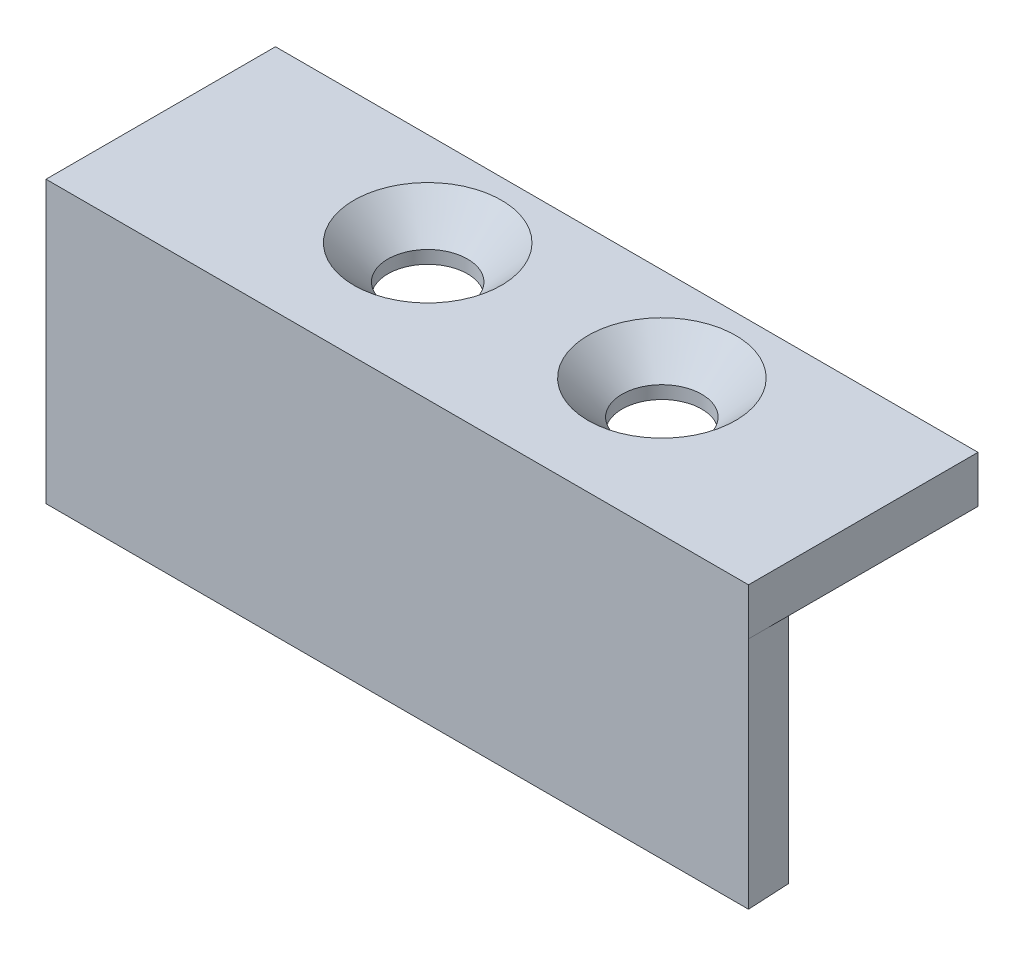
ISO-10303-21;
HEADER;
FILE_DESCRIPTION(('STEP AP214'),'2;1');
FILE_NAME('part.step','',(''),(''),'','','');
FILE_SCHEMA(('AUTOMOTIVE_DESIGN { 1 0 10303 214 1 1 1 1 }'));
ENDSEC;
DATA;
#1=APPLICATION_CONTEXT('core data for automotive mechanical design processes');
#2=APPLICATION_PROTOCOL_DEFINITION('international standard','automotive_design',2000,#1);
#3=PRODUCT_CONTEXT('',#1,'mechanical');
#4=PRODUCT('Part','Part','',(#3));
#5=PRODUCT_RELATED_PRODUCT_CATEGORY('part','',(#4));
#6=PRODUCT_DEFINITION_FORMATION('','',#4);
#7=PRODUCT_DEFINITION_CONTEXT('part definition',#1,'design');
#8=PRODUCT_DEFINITION('design','',#6,#7);
#9=PRODUCT_DEFINITION_SHAPE('','',#8);
#10=(LENGTH_UNIT() NAMED_UNIT(*) SI_UNIT(.MILLI.,.METRE.));
#11=(NAMED_UNIT(*) PLANE_ANGLE_UNIT() SI_UNIT($,.RADIAN.));
#12=(NAMED_UNIT(*) SI_UNIT($,.STERADIAN.) SOLID_ANGLE_UNIT());
#13=UNCERTAINTY_MEASURE_WITH_UNIT(LENGTH_MEASURE(1.E-05),#10,'distance_accuracy_value','');
#14=(GEOMETRIC_REPRESENTATION_CONTEXT(3) GLOBAL_UNCERTAINTY_ASSIGNED_CONTEXT((#13)) GLOBAL_UNIT_ASSIGNED_CONTEXT((#10,
#11,#12)) REPRESENTATION_CONTEXT('',''));
#15=CARTESIAN_POINT('',(0.,0.,0.));
#16=DIRECTION('',(0.,0.,1.));
#17=DIRECTION('',(1.,0.,0.));
#18=AXIS2_PLACEMENT_3D('',#15,#16,#17);
#19=CARTESIAN_POINT('',(0.,0.,0.));
#20=DIRECTION('',(0.,1.,0.));
#21=DIRECTION('',(0.,0.,1.));
#22=AXIS2_PLACEMENT_3D('',#19,#20,#21);
#23=PLANE('',#22);
#24=CARTESIAN_POINT('',(10.5,0.,-9.));
#25=DIRECTION('',(0.,1.,0.));
#26=DIRECTION('',(0.,0.,1.));
#27=AXIS2_PLACEMENT_3D('',#24,#25,#26);
#28=CIRCLE('',#27,1.69999999999999);
#29=CARTESIAN_POINT('',(10.5,0.,-7.30000000000001));
#30=VERTEX_POINT('',#29);
#31=EDGE_CURVE('E143',#30,#30,#28,.T.);
#32=ORIENTED_EDGE('',*,*,#31,.T.);
#33=EDGE_LOOP('',(#32));
#34=FACE_BOUND('',#33,.T.);
#35=CARTESIAN_POINT('',(0.500000000000007,0.,-9.));
#36=DIRECTION('',(0.,1.,0.));
#37=DIRECTION('',(0.,0.,1.));
#38=AXIS2_PLACEMENT_3D('',#35,#36,#37);
#39=CIRCLE('',#38,1.69999999999999);
#40=CARTESIAN_POINT('',(0.500000000000007,0.,-7.3));
#41=VERTEX_POINT('',#40);
#42=EDGE_CURVE('E36',#41,#41,#39,.T.);
#43=ORIENTED_EDGE('',*,*,#42,.T.);
#44=EDGE_LOOP('',(#43));
#45=FACE_BOUND('',#44,.T.);
#46=DIRECTION('',(0.0520185859715963,0.,0.998646116856975));
#47=VECTOR('',#46,1.);
#48=CARTESIAN_POINT('',(20.,0.,-3.19999999999999));
#49=LINE('',#48,#47);
#50=CARTESIAN_POINT('',(19.9063665452511,0.,-4.99756301034248));
#51=VERTEX_POINT('',#50);
#52=CARTESIAN_POINT('',(20.,0.,-3.19999999999994));
#53=VERTEX_POINT('',#52);
#54=EDGE_CURVE('E117',#51,#53,#49,.T.);
#55=ORIENTED_EDGE('',*,*,#54,.F.);
#56=DIRECTION('',(1.,0.,0.));
#57=VECTOR('',#56,1.);
#58=CARTESIAN_POINT('',(19.9063665452511,0.,-4.99756301034248));
#59=LINE('',#58,#57);
#60=CARTESIAN_POINT('',(-9.99999999999999,0.,-4.99756301034247));
#61=VERTEX_POINT('',#60);
#62=EDGE_CURVE('E49',#61,#51,#59,.T.);
#63=ORIENTED_EDGE('',*,*,#62,.F.);
#64=DIRECTION('',(0.,0.,1.));
#65=VECTOR('',#64,1.);
#66=CARTESIAN_POINT('',(-10.,0.,-12.9999999999999));
#67=LINE('',#66,#65);
#68=CARTESIAN_POINT('',(-10.,0.,-12.9999999999999));
#69=VERTEX_POINT('',#68);
#70=EDGE_CURVE('E151',#69,#61,#67,.T.);
#71=ORIENTED_EDGE('',*,*,#70,.F.);
#72=DIRECTION('',(-1.,0.,0.));
#73=VECTOR('',#72,1.);
#74=CARTESIAN_POINT('',(-10.,0.,-12.9999999999999));
#75=LINE('',#74,#73);
#76=CARTESIAN_POINT('',(20.,0.,-13.));
#77=VERTEX_POINT('',#76);
#78=EDGE_CURVE('E76',#77,#69,#75,.T.);
#79=ORIENTED_EDGE('',*,*,#78,.F.);
#80=DIRECTION('',(0.,0.,-1.));
#81=VECTOR('',#80,1.);
#82=CARTESIAN_POINT('',(20.,0.,-13.));
#83=LINE('',#82,#81);
#84=EDGE_CURVE('E153',#53,#77,#83,.T.);
#85=ORIENTED_EDGE('',*,*,#84,.F.);
#86=EDGE_LOOP('',(#55,#63,#71,#79,#85));
#87=FACE_BOUND('',#86,.T.);
#88=ADVANCED_FACE('F32',(#34,#45,#87),#23,.F.);
#89=CARTESIAN_POINT('',(-10.,2.,-12.9999999999999));
#90=DIRECTION('',(1.,0.,0.));
#91=DIRECTION('',(0.,0.,-1.));
#92=AXIS2_PLACEMENT_3D('',#89,#90,#91);
#93=PLANE('',#92);
#94=ORIENTED_EDGE('',*,*,#70,.T.);
#95=DIRECTION('',(0.,1.,0.));
#96=VECTOR('',#95,1.);
#97=CARTESIAN_POINT('',(-10.,-10.,-4.99756301034247));
#98=LINE('',#97,#96);
#99=CARTESIAN_POINT('',(-10.,-10.,-4.99756301034247));
#100=VERTEX_POINT('',#99);
#101=EDGE_CURVE('E108',#100,#61,#98,.T.);
#102=ORIENTED_EDGE('',*,*,#101,.F.);
#103=DIRECTION('',(0.,0.,-1.));
#104=VECTOR('',#103,1.);
#105=CARTESIAN_POINT('',(-9.99999999999999,-10.,-3.19999999999991));
#106=LINE('',#105,#104);
#107=CARTESIAN_POINT('',(-9.99999999999999,-10.,-3.19999999999991));
#108=VERTEX_POINT('',#107);
#109=EDGE_CURVE('E106',#108,#100,#106,.T.);
#110=ORIENTED_EDGE('',*,*,#109,.F.);
#111=DIRECTION('',(0.,-1.,0.));
#112=VECTOR('',#111,1.);
#113=CARTESIAN_POINT('',(-9.99999999999999,2.,-3.19999999999991));
#114=LINE('',#113,#112);
#115=CARTESIAN_POINT('',(-9.99999999999999,2.,-3.19999999999991));
#116=VERTEX_POINT('',#115);
#117=EDGE_CURVE('E11',#116,#108,#114,.T.);
#118=ORIENTED_EDGE('',*,*,#117,.F.);
#119=DIRECTION('',(0.,0.,1.));
#120=VECTOR('',#119,1.);
#121=CARTESIAN_POINT('',(-10.,2.,-12.9999999999999));
#122=LINE('',#121,#120);
#123=CARTESIAN_POINT('',(-10.,2.,-12.9999999999999));
#124=VERTEX_POINT('',#123);
#125=EDGE_CURVE('E144',#124,#116,#122,.T.);
#126=ORIENTED_EDGE('',*,*,#125,.F.);
#127=DIRECTION('',(0.,-1.,0.));
#128=VECTOR('',#127,1.);
#129=CARTESIAN_POINT('',(-10.,2.,-12.9999999999999));
#130=LINE('',#129,#128);
#131=EDGE_CURVE('E150',#124,#69,#130,.T.);
#132=ORIENTED_EDGE('',*,*,#131,.T.);
#133=EDGE_LOOP('',(#94,#102,#110,#118,#126,#132));
#134=FACE_BOUND('',#133,.T.);
#135=ADVANCED_FACE('F34',(#134),#93,.F.);
#136=CARTESIAN_POINT('',(-9.99999999999999,2.,-3.19999999999991));
#137=DIRECTION('',(0.,0.,-1.));
#138=DIRECTION('',(-1.,0.,0.));
#139=AXIS2_PLACEMENT_3D('',#136,#137,#138);
#140=PLANE('',#139);
#141=ORIENTED_EDGE('',*,*,#117,.T.);
#142=DIRECTION('',(-1.,0.,0.));
#143=VECTOR('',#142,1.);
#144=CARTESIAN_POINT('',(-9.99999999999999,-10.,-3.19999999999991));
#145=LINE('',#144,#143);
#146=CARTESIAN_POINT('',(20.,-10.,-3.19999999999999));
#147=VERTEX_POINT('',#146);
#148=EDGE_CURVE('E102',#147,#108,#145,.T.);
#149=ORIENTED_EDGE('',*,*,#148,.F.);
#150=DIRECTION('',(0.,1.,0.));
#151=VECTOR('',#150,1.);
#152=CARTESIAN_POINT('',(20.,-10.,-3.19999999999999));
#153=LINE('',#152,#151);
#154=EDGE_CURVE('E124',#147,#53,#153,.T.);
#155=ORIENTED_EDGE('',*,*,#154,.T.);
#156=DIRECTION('',(0.,-1.,0.));
#157=VECTOR('',#156,1.);
#158=CARTESIAN_POINT('',(20.,2.,-3.19999999999994));
#159=LINE('',#158,#157);
#160=CARTESIAN_POINT('',(20.,2.,-3.19999999999994));
#161=VERTEX_POINT('',#160);
#162=EDGE_CURVE('E41',#161,#53,#159,.T.);
#163=ORIENTED_EDGE('',*,*,#162,.F.);
#164=DIRECTION('',(1.,0.,0.));
#165=VECTOR('',#164,1.);
#166=CARTESIAN_POINT('',(-9.99999999999999,2.,-3.19999999999991));
#167=LINE('',#166,#165);
#168=EDGE_CURVE('E83',#116,#161,#167,.T.);
#169=ORIENTED_EDGE('',*,*,#168,.F.);
#170=EDGE_LOOP('',(#141,#149,#155,#163,#169));
#171=FACE_BOUND('',#170,.T.);
#172=ADVANCED_FACE('F99',(#171),#140,.F.);
#173=CARTESIAN_POINT('',(20.,2.,-13.));
#174=DIRECTION('',(-1.,0.,0.));
#175=DIRECTION('',(0.,0.,1.));
#176=AXIS2_PLACEMENT_3D('',#173,#174,#175);
#177=PLANE('',#176);
#178=ORIENTED_EDGE('',*,*,#84,.T.);
#179=DIRECTION('',(0.,-1.,0.));
#180=VECTOR('',#179,1.);
#181=CARTESIAN_POINT('',(20.,2.,-13.));
#182=LINE('',#181,#180);
#183=CARTESIAN_POINT('',(20.,2.,-13.));
#184=VERTEX_POINT('',#183);
#185=EDGE_CURVE('E157',#184,#77,#182,.T.);
#186=ORIENTED_EDGE('',*,*,#185,.F.);
#187=DIRECTION('',(0.,0.,-1.));
#188=VECTOR('',#187,1.);
#189=CARTESIAN_POINT('',(20.,2.,-13.));
#190=LINE('',#189,#188);
#191=EDGE_CURVE('E147',#161,#184,#190,.T.);
#192=ORIENTED_EDGE('',*,*,#191,.F.);
#193=ORIENTED_EDGE('',*,*,#162,.T.);
#194=EDGE_LOOP('',(#178,#186,#192,#193));
#195=FACE_BOUND('',#194,.T.);
#196=ADVANCED_FACE('F188',(#195),#177,.F.);
#197=CARTESIAN_POINT('',(-10.,2.,-12.9999999999999));
#198=DIRECTION('',(0.,0.,1.));
#199=DIRECTION('',(1.,0.,0.));
#200=AXIS2_PLACEMENT_3D('',#197,#198,#199);
#201=PLANE('',#200);
#202=ORIENTED_EDGE('',*,*,#78,.T.);
#203=ORIENTED_EDGE('',*,*,#131,.F.);
#204=DIRECTION('',(-1.,0.,0.));
#205=VECTOR('',#204,1.);
#206=CARTESIAN_POINT('',(-10.,2.,-12.9999999999999));
#207=LINE('',#206,#205);
#208=EDGE_CURVE('E58',#184,#124,#207,.T.);
#209=ORIENTED_EDGE('',*,*,#208,.F.);
#210=ORIENTED_EDGE('',*,*,#185,.T.);
#211=EDGE_LOOP('',(#202,#203,#209,#210));
#212=FACE_BOUND('',#211,.T.);
#213=ADVANCED_FACE('F177',(#212),#201,.F.);
#214=CARTESIAN_POINT('',(0.,2.,0.));
#215=DIRECTION('',(0.,1.,0.));
#216=DIRECTION('',(0.,0.,1.));
#217=AXIS2_PLACEMENT_3D('',#214,#215,#216);
#218=PLANE('',#217);
#219=CARTESIAN_POINT('',(0.500000000000007,2.,-9.));
#220=DIRECTION('',(0.,1.,0.));
#221=DIRECTION('',(0.,0.,1.));
#222=AXIS2_PLACEMENT_3D('',#219,#220,#221);
#223=CIRCLE('',#222,3.15);
#224=CARTESIAN_POINT('',(0.500000000000007,2.,-5.85));
#225=VERTEX_POINT('',#224);
#226=EDGE_CURVE('E131',#225,#225,#223,.T.);
#227=ORIENTED_EDGE('',*,*,#226,.F.);
#228=EDGE_LOOP('',(#227));
#229=FACE_BOUND('',#228,.T.);
#230=CARTESIAN_POINT('',(10.5,2.,-9.));
#231=DIRECTION('',(0.,1.,0.));
#232=DIRECTION('',(0.,0.,1.));
#233=AXIS2_PLACEMENT_3D('',#230,#231,#232);
#234=CIRCLE('',#233,3.15);
#235=CARTESIAN_POINT('',(10.5,2.,-5.85));
#236=VERTEX_POINT('',#235);
#237=EDGE_CURVE('E137',#236,#236,#234,.T.);
#238=ORIENTED_EDGE('',*,*,#237,.F.);
#239=EDGE_LOOP('',(#238));
#240=FACE_BOUND('',#239,.T.);
#241=ORIENTED_EDGE('',*,*,#125,.T.);
#242=ORIENTED_EDGE('',*,*,#168,.T.);
#243=ORIENTED_EDGE('',*,*,#191,.T.);
#244=ORIENTED_EDGE('',*,*,#208,.T.);
#245=EDGE_LOOP('',(#241,#242,#243,#244));
#246=FACE_BOUND('',#245,.T.);
#247=ADVANCED_FACE('F167',(#229,#240,#246),#218,.T.);
#248=CARTESIAN_POINT('',(10.5,2.,-9.));
#249=DIRECTION('',(0.,1.,0.));
#250=DIRECTION('',(0.,0.,1.));
#251=AXIS2_PLACEMENT_3D('',#248,#249,#250);
#252=CYLINDRICAL_SURFACE('',#251,1.69999999999999);
#253=CARTESIAN_POINT('',(10.5,0.549999999999999,-9.));
#254=DIRECTION('',(0.,1.,0.));
#255=DIRECTION('',(0.,0.,1.));
#256=AXIS2_PLACEMENT_3D('',#253,#254,#255);
#257=CIRCLE('',#256,1.7);
#258=CARTESIAN_POINT('',(10.5,0.549999999999999,-7.3));
#259=VERTEX_POINT('',#258);
#260=EDGE_CURVE('E140',#259,#259,#257,.T.);
#261=ORIENTED_EDGE('',*,*,#260,.T.);
#262=EDGE_LOOP('',(#261));
#263=FACE_BOUND('',#262,.T.);
#264=ORIENTED_EDGE('',*,*,#31,.F.);
#265=EDGE_LOOP('',(#264));
#266=FACE_BOUND('',#265,.T.);
#267=ADVANCED_FACE('F164',(#263,#266),#252,.F.);
#268=CARTESIAN_POINT('',(10.5,2.,-9.));
#269=DIRECTION('',(0.,1.,0.));
#270=DIRECTION('',(0.,0.,1.));
#271=AXIS2_PLACEMENT_3D('',#268,#269,#270);
#272=CONICAL_SURFACE('',#271,3.15,0.785398163397448);
#273=ORIENTED_EDGE('',*,*,#260,.F.);
#274=EDGE_LOOP('',(#273));
#275=FACE_BOUND('',#274,.T.);
#276=ORIENTED_EDGE('',*,*,#237,.T.);
#277=EDGE_LOOP('',(#276));
#278=FACE_BOUND('',#277,.T.);
#279=ADVANCED_FACE('F166',(#275,#278),#272,.F.);
#280=CARTESIAN_POINT('',(0.500000000000007,2.,-9.));
#281=DIRECTION('',(0.,1.,0.));
#282=DIRECTION('',(0.,0.,1.));
#283=AXIS2_PLACEMENT_3D('',#280,#281,#282);
#284=CYLINDRICAL_SURFACE('',#283,1.69999999999999);
#285=CARTESIAN_POINT('',(0.500000000000007,0.549999999999999,-9.));
#286=DIRECTION('',(0.,1.,0.));
#287=DIRECTION('',(0.,0.,1.));
#288=AXIS2_PLACEMENT_3D('',#285,#286,#287);
#289=CIRCLE('',#288,1.7);
#290=CARTESIAN_POINT('',(0.500000000000007,0.549999999999999,-7.3));
#291=VERTEX_POINT('',#290);
#292=EDGE_CURVE('E134',#291,#291,#289,.T.);
#293=ORIENTED_EDGE('',*,*,#292,.T.);
#294=EDGE_LOOP('',(#293));
#295=FACE_BOUND('',#294,.T.);
#296=ORIENTED_EDGE('',*,*,#42,.F.);
#297=EDGE_LOOP('',(#296));
#298=FACE_BOUND('',#297,.T.);
#299=ADVANCED_FACE('F174',(#295,#298),#284,.F.);
#300=CARTESIAN_POINT('',(0.500000000000007,2.,-9.));
#301=DIRECTION('',(0.,1.,0.));
#302=DIRECTION('',(0.,0.,1.));
#303=AXIS2_PLACEMENT_3D('',#300,#301,#302);
#304=CONICAL_SURFACE('',#303,3.15,0.785398163397448);
#305=ORIENTED_EDGE('',*,*,#292,.F.);
#306=EDGE_LOOP('',(#305));
#307=FACE_BOUND('',#306,.T.);
#308=ORIENTED_EDGE('',*,*,#226,.T.);
#309=EDGE_LOOP('',(#308));
#310=FACE_BOUND('',#309,.T.);
#311=ADVANCED_FACE('F228',(#307,#310),#304,.F.);
#312=CARTESIAN_POINT('',(19.9063665452511,-10.,-4.99756301034248));
#313=DIRECTION('',(0.,0.,1.));
#314=DIRECTION('',(1.,0.,0.));
#315=AXIS2_PLACEMENT_3D('',#312,#313,#314);
#316=PLANE('',#315);
#317=ORIENTED_EDGE('',*,*,#62,.T.);
#318=DIRECTION('',(0.,1.,0.));
#319=VECTOR('',#318,1.);
#320=CARTESIAN_POINT('',(19.9063665452511,-10.,-4.99756301034248));
#321=LINE('',#320,#319);
#322=CARTESIAN_POINT('',(19.9063665452511,-10.,-4.99756301034248));
#323=VERTEX_POINT('',#322);
#324=EDGE_CURVE('E127',#323,#51,#321,.T.);
#325=ORIENTED_EDGE('',*,*,#324,.F.);
#326=DIRECTION('',(1.,0.,0.));
#327=VECTOR('',#326,1.);
#328=CARTESIAN_POINT('',(19.9063665452511,-10.,-4.99756301034248));
#329=LINE('',#328,#327);
#330=EDGE_CURVE('E111',#100,#323,#329,.T.);
#331=ORIENTED_EDGE('',*,*,#330,.F.);
#332=ORIENTED_EDGE('',*,*,#101,.T.);
#333=EDGE_LOOP('',(#317,#325,#331,#332));
#334=FACE_BOUND('',#333,.T.);
#335=ADVANCED_FACE('F237',(#334),#316,.F.);
#336=CARTESIAN_POINT('',(20.,-10.,-3.19999999999999));
#337=DIRECTION('',(-0.998646116856975,0.,0.0520185859715963));
#338=DIRECTION('',(0.0520185859715963,0.,0.998646116856975));
#339=AXIS2_PLACEMENT_3D('',#336,#337,#338);
#340=PLANE('',#339);
#341=ORIENTED_EDGE('',*,*,#54,.T.);
#342=ORIENTED_EDGE('',*,*,#154,.F.);
#343=DIRECTION('',(0.0520185859715963,0.,0.998646116856975));
#344=VECTOR('',#343,1.);
#345=CARTESIAN_POINT('',(20.,-10.,-3.19999999999999));
#346=LINE('',#345,#344);
#347=EDGE_CURVE('E115',#323,#147,#346,.T.);
#348=ORIENTED_EDGE('',*,*,#347,.F.);
#349=ORIENTED_EDGE('',*,*,#324,.T.);
#350=EDGE_LOOP('',(#341,#342,#348,#349));
#351=FACE_BOUND('',#350,.T.);
#352=ADVANCED_FACE('F264',(#351),#340,.F.);
#353=CARTESIAN_POINT('',(0.,-10.,0.));
#354=DIRECTION('',(0.,1.,0.));
#355=DIRECTION('',(0.,0.,1.));
#356=AXIS2_PLACEMENT_3D('',#353,#354,#355);
#357=PLANE('',#356);
#358=ORIENTED_EDGE('',*,*,#148,.T.);
#359=ORIENTED_EDGE('',*,*,#109,.T.);
#360=ORIENTED_EDGE('',*,*,#330,.T.);
#361=ORIENTED_EDGE('',*,*,#347,.T.);
#362=EDGE_LOOP('',(#358,#359,#360,#361));
#363=FACE_BOUND('',#362,.T.);
#364=ADVANCED_FACE('F113',(#363),#357,.F.);
#365=CLOSED_SHELL('',(#88,#135,#172,#196,#213,#247,#267,#279,#299,#311,#335,#352,#364));
#366=MANIFOLD_SOLID_BREP('B2',#365);
#367=ADVANCED_BREP_SHAPE_REPRESENTATION('',(#18,#366),#14);
#368=SHAPE_DEFINITION_REPRESENTATION(#9,#367);
ENDSEC;
END-ISO-10303-21;
